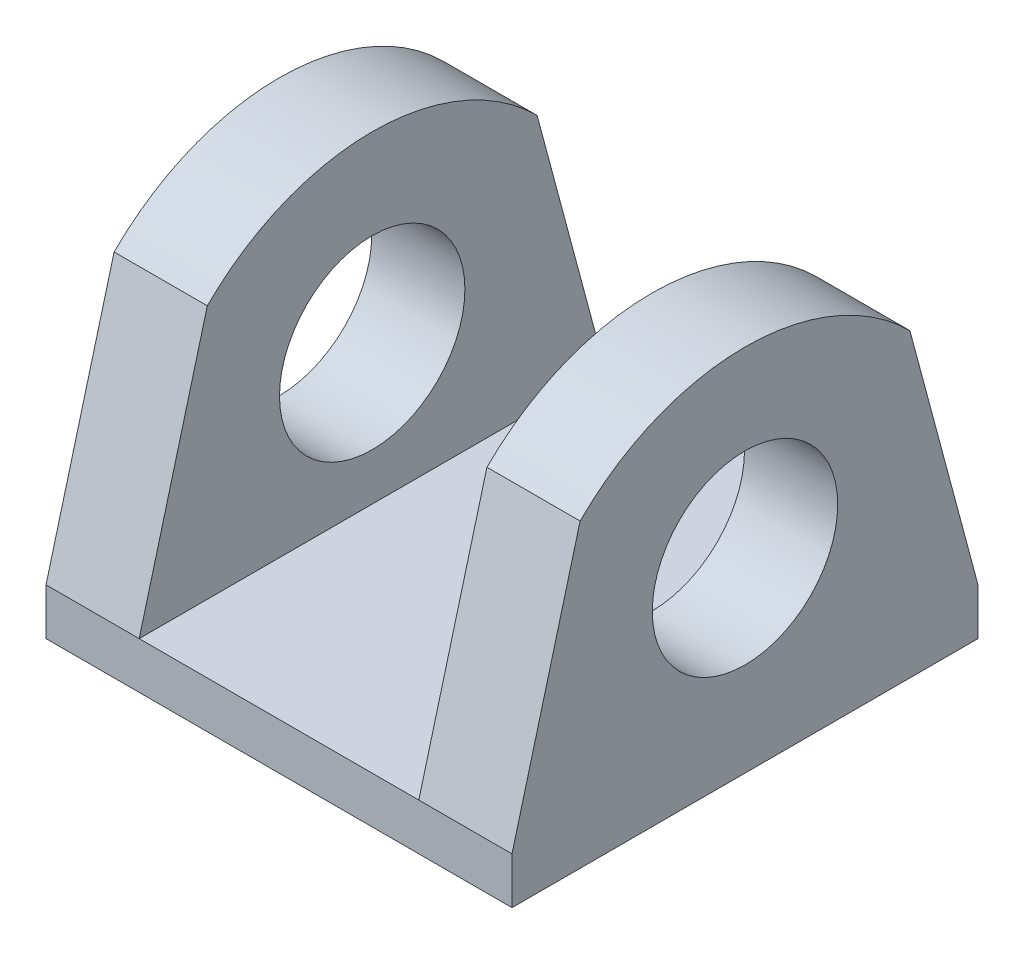
ISO-10303-21;
HEADER;
FILE_DESCRIPTION(('STEP AP214'),'2;1');
FILE_NAME('part.step','',(''),(''),'','','');
FILE_SCHEMA(('AUTOMOTIVE_DESIGN { 1 0 10303 214 1 1 1 1 }'));
ENDSEC;
DATA;
#1=APPLICATION_CONTEXT('core data for automotive mechanical design processes');
#2=APPLICATION_PROTOCOL_DEFINITION('international standard','automotive_design',2000,#1);
#3=PRODUCT_CONTEXT('',#1,'mechanical');
#4=PRODUCT('Part','Part','',(#3));
#5=PRODUCT_RELATED_PRODUCT_CATEGORY('part','',(#4));
#6=PRODUCT_DEFINITION_FORMATION('','',#4);
#7=PRODUCT_DEFINITION_CONTEXT('part definition',#1,'design');
#8=PRODUCT_DEFINITION('design','',#6,#7);
#9=PRODUCT_DEFINITION_SHAPE('','',#8);
#10=(LENGTH_UNIT() NAMED_UNIT(*) SI_UNIT(.MILLI.,.METRE.));
#11=(NAMED_UNIT(*) PLANE_ANGLE_UNIT() SI_UNIT($,.RADIAN.));
#12=(NAMED_UNIT(*) SI_UNIT($,.STERADIAN.) SOLID_ANGLE_UNIT());
#13=UNCERTAINTY_MEASURE_WITH_UNIT(LENGTH_MEASURE(1.E-05),#10,'distance_accuracy_value','');
#14=(GEOMETRIC_REPRESENTATION_CONTEXT(3) GLOBAL_UNCERTAINTY_ASSIGNED_CONTEXT((#13)) GLOBAL_UNIT_ASSIGNED_CONTEXT((#10,
#11,#12)) REPRESENTATION_CONTEXT('',''));
#15=CARTESIAN_POINT('',(0.,0.,0.));
#16=DIRECTION('',(0.,0.,1.));
#17=DIRECTION('',(1.,0.,0.));
#18=AXIS2_PLACEMENT_3D('',#15,#16,#17);
#19=CARTESIAN_POINT('',(12.7,2.54,12.7));
#20=DIRECTION('',(-1.,0.,0.));
#21=DIRECTION('',(0.,0.,1.));
#22=AXIS2_PLACEMENT_3D('',#19,#20,#21);
#23=PLANE('',#22);
#24=CARTESIAN_POINT('',(12.7,10.16,0.));
#25=DIRECTION('',(1.,0.,0.));
#26=DIRECTION('',(0.,0.,-1.));
#27=AXIS2_PLACEMENT_3D('',#24,#25,#26);
#28=CIRCLE('',#27,5.05316944316768);
#29=CARTESIAN_POINT('',(12.7,10.16,-5.05316944316768));
#30=VERTEX_POINT('',#29);
#31=EDGE_CURVE('E245',#30,#30,#28,.T.);
#32=ORIENTED_EDGE('',*,*,#31,.F.);
#33=EDGE_LOOP('',(#32));
#34=FACE_BOUND('',#33,.T.);
#35=DIRECTION('',(0.,0.,-1.));
#36=VECTOR('',#35,1.);
#37=CARTESIAN_POINT('',(12.7,0.,12.7));
#38=LINE('',#37,#36);
#39=CARTESIAN_POINT('',(12.7,0.,12.7));
#40=VERTEX_POINT('',#39);
#41=CARTESIAN_POINT('',(12.7,0.,-12.7));
#42=VERTEX_POINT('',#41);
#43=EDGE_CURVE('E172',#40,#42,#38,.T.);
#44=ORIENTED_EDGE('',*,*,#43,.T.);
#45=DIRECTION('',(0.,-1.,0.));
#46=VECTOR('',#45,1.);
#47=CARTESIAN_POINT('',(12.7,2.54,-12.7));
#48=LINE('',#47,#46);
#49=CARTESIAN_POINT('',(12.7,2.54,-12.7));
#50=VERTEX_POINT('',#49);
#51=EDGE_CURVE('E11',#50,#42,#48,.T.);
#52=ORIENTED_EDGE('',*,*,#51,.F.);
#53=DIRECTION('',(0.,0.965925826289067,0.258819045102525));
#54=VECTOR('',#53,1.);
#55=CARTESIAN_POINT('',(12.7,2.54,-12.7));
#56=LINE('',#55,#54);
#57=CARTESIAN_POINT('',(12.7,16.3947579938712,-8.98762878421351));
#58=VERTEX_POINT('',#57);
#59=EDGE_CURVE('E147',#50,#58,#56,.T.);
#60=ORIENTED_EDGE('',*,*,#59,.T.);
#61=CARTESIAN_POINT('',(12.7,7.40712920965758,0.));
#62=DIRECTION('',(1.,0.,0.));
#63=DIRECTION('',(0.,0.,1.));
#64=AXIS2_PLACEMENT_3D('',#61,#62,#63);
#65=CIRCLE('',#64,12.7104265202097);
#66=CARTESIAN_POINT('',(12.7,16.3947579938712,8.98762878421363));
#67=VERTEX_POINT('',#66);
#68=EDGE_CURVE('E165',#58,#67,#65,.T.);
#69=ORIENTED_EDGE('',*,*,#68,.T.);
#70=DIRECTION('',(0.,-0.965925826289069,0.258819045102518));
#71=VECTOR('',#70,1.);
#72=CARTESIAN_POINT('',(12.7,2.54,12.7));
#73=LINE('',#72,#71);
#74=CARTESIAN_POINT('',(12.7,2.54,12.7));
#75=VERTEX_POINT('',#74);
#76=EDGE_CURVE('E153',#67,#75,#73,.T.);
#77=ORIENTED_EDGE('',*,*,#76,.T.);
#78=DIRECTION('',(0.,-1.,0.));
#79=VECTOR('',#78,1.);
#80=CARTESIAN_POINT('',(12.7,2.54,12.7));
#81=LINE('',#80,#79);
#82=EDGE_CURVE('E182',#75,#40,#81,.T.);
#83=ORIENTED_EDGE('',*,*,#82,.T.);
#84=EDGE_LOOP('',(#44,#52,#60,#69,#77,#83));
#85=FACE_BOUND('',#84,.T.);
#86=ADVANCED_FACE('F33',(#34,#85),#23,.F.);
#87=CARTESIAN_POINT('',(-12.7,2.54,-12.7));
#88=DIRECTION('',(0.,0.,1.));
#89=DIRECTION('',(1.,0.,0.));
#90=AXIS2_PLACEMENT_3D('',#87,#88,#89);
#91=PLANE('',#90);
#92=DIRECTION('',(-1.,0.,0.));
#93=VECTOR('',#92,1.);
#94=CARTESIAN_POINT('',(-12.7,0.,-12.7));
#95=LINE('',#94,#93);
#96=CARTESIAN_POINT('',(-12.7,0.,-12.7));
#97=VERTEX_POINT('',#96);
#98=EDGE_CURVE('E185',#42,#97,#95,.T.);
#99=ORIENTED_EDGE('',*,*,#98,.T.);
#100=DIRECTION('',(0.,-1.,0.));
#101=VECTOR('',#100,1.);
#102=CARTESIAN_POINT('',(-12.7,2.54,-12.7));
#103=LINE('',#102,#101);
#104=CARTESIAN_POINT('',(-12.7,2.54,-12.7));
#105=VERTEX_POINT('',#104);
#106=EDGE_CURVE('E41',#105,#97,#103,.T.);
#107=ORIENTED_EDGE('',*,*,#106,.F.);
#108=DIRECTION('',(-1.,0.,0.));
#109=VECTOR('',#108,1.);
#110=CARTESIAN_POINT('',(-7.62,2.54,-12.7));
#111=LINE('',#110,#109);
#112=CARTESIAN_POINT('',(-7.62,2.54,-12.7));
#113=VERTEX_POINT('',#112);
#114=EDGE_CURVE('E48',#113,#105,#111,.T.);
#115=ORIENTED_EDGE('',*,*,#114,.F.);
#116=DIRECTION('',(-1.,0.,0.));
#117=VECTOR('',#116,1.);
#118=CARTESIAN_POINT('',(-12.7,2.54,-12.7));
#119=LINE('',#118,#117);
#120=CARTESIAN_POINT('',(7.62,2.54,-12.7));
#121=VERTEX_POINT('',#120);
#122=EDGE_CURVE('E180',#121,#113,#119,.T.);
#123=ORIENTED_EDGE('',*,*,#122,.F.);
#124=EDGE_CURVE('E176',#50,#121,#119,.T.);
#125=ORIENTED_EDGE('',*,*,#124,.F.);
#126=ORIENTED_EDGE('',*,*,#51,.T.);
#127=EDGE_LOOP('',(#99,#107,#115,#123,#125,#126));
#128=FACE_BOUND('',#127,.T.);
#129=ADVANCED_FACE('F225',(#128),#91,.F.);
#130=CARTESIAN_POINT('',(-12.7,2.54,12.7));
#131=DIRECTION('',(1.,0.,0.));
#132=DIRECTION('',(0.,0.,-1.));
#133=AXIS2_PLACEMENT_3D('',#130,#131,#132);
#134=PLANE('',#133);
#135=CARTESIAN_POINT('',(-12.7,10.16,0.));
#136=DIRECTION('',(1.,0.,0.));
#137=DIRECTION('',(0.,0.,-1.));
#138=AXIS2_PLACEMENT_3D('',#135,#136,#137);
#139=CIRCLE('',#138,5.05316944316768);
#140=CARTESIAN_POINT('',(-12.7,10.16,-5.05316944316768));
#141=VERTEX_POINT('',#140);
#142=EDGE_CURVE('E247',#141,#141,#139,.T.);
#143=ORIENTED_EDGE('',*,*,#142,.T.);
#144=EDGE_LOOP('',(#143));
#145=FACE_BOUND('',#144,.T.);
#146=DIRECTION('',(0.,0.,1.));
#147=VECTOR('',#146,1.);
#148=CARTESIAN_POINT('',(-12.7,0.,12.7));
#149=LINE('',#148,#147);
#150=CARTESIAN_POINT('',(-12.7,0.,12.7));
#151=VERTEX_POINT('',#150);
#152=EDGE_CURVE('E187',#97,#151,#149,.T.);
#153=ORIENTED_EDGE('',*,*,#152,.T.);
#154=DIRECTION('',(0.,-1.,0.));
#155=VECTOR('',#154,1.);
#156=CARTESIAN_POINT('',(-12.7,2.54,12.7));
#157=LINE('',#156,#155);
#158=CARTESIAN_POINT('',(-12.7,2.54,12.7));
#159=VERTEX_POINT('',#158);
#160=EDGE_CURVE('E193',#159,#151,#157,.T.);
#161=ORIENTED_EDGE('',*,*,#160,.F.);
#162=DIRECTION('',(0.,-0.965925826289069,0.258819045102518));
#163=VECTOR('',#162,1.);
#164=CARTESIAN_POINT('',(-12.7,2.54,12.7));
#165=LINE('',#164,#163);
#166=CARTESIAN_POINT('',(-12.7,16.3947579938712,8.98762878421363));
#167=VERTEX_POINT('',#166);
#168=EDGE_CURVE('E141',#167,#159,#165,.T.);
#169=ORIENTED_EDGE('',*,*,#168,.F.);
#170=CARTESIAN_POINT('',(-12.7,7.40712920965758,0.));
#171=DIRECTION('',(1.,0.,0.));
#172=DIRECTION('',(0.,0.,1.));
#173=AXIS2_PLACEMENT_3D('',#170,#171,#172);
#174=CIRCLE('',#173,12.7104265202097);
#175=CARTESIAN_POINT('',(-12.7,16.3947579938712,-8.98762878421351));
#176=VERTEX_POINT('',#175);
#177=EDGE_CURVE('E127',#176,#167,#174,.T.);
#178=ORIENTED_EDGE('',*,*,#177,.F.);
#179=DIRECTION('',(0.,0.965925826289067,0.258819045102525));
#180=VECTOR('',#179,1.);
#181=CARTESIAN_POINT('',(-12.7,2.54,-12.7));
#182=LINE('',#181,#180);
#183=EDGE_CURVE('E136',#105,#176,#182,.T.);
#184=ORIENTED_EDGE('',*,*,#183,.F.);
#185=ORIENTED_EDGE('',*,*,#106,.T.);
#186=EDGE_LOOP('',(#153,#161,#169,#178,#184,#185));
#187=FACE_BOUND('',#186,.T.);
#188=ADVANCED_FACE('F200',(#145,#187),#134,.F.);
#189=CARTESIAN_POINT('',(-12.7,2.54,12.7));
#190=DIRECTION('',(0.,0.,-1.));
#191=DIRECTION('',(-1.,0.,0.));
#192=AXIS2_PLACEMENT_3D('',#189,#190,#191);
#193=PLANE('',#192);
#194=DIRECTION('',(1.,0.,0.));
#195=VECTOR('',#194,1.);
#196=CARTESIAN_POINT('',(-12.7,0.,12.7));
#197=LINE('',#196,#195);
#198=EDGE_CURVE('E189',#151,#40,#197,.T.);
#199=ORIENTED_EDGE('',*,*,#198,.T.);
#200=ORIENTED_EDGE('',*,*,#82,.F.);
#201=DIRECTION('',(1.,0.,0.));
#202=VECTOR('',#201,1.);
#203=CARTESIAN_POINT('',(7.62,2.54,12.7));
#204=LINE('',#203,#202);
#205=CARTESIAN_POINT('',(7.62,2.54,12.7));
#206=VERTEX_POINT('',#205);
#207=EDGE_CURVE('E170',#206,#75,#204,.T.);
#208=ORIENTED_EDGE('',*,*,#207,.F.);
#209=DIRECTION('',(1.,0.,0.));
#210=VECTOR('',#209,1.);
#211=CARTESIAN_POINT('',(-12.7,2.54,12.7));
#212=LINE('',#211,#210);
#213=CARTESIAN_POINT('',(-7.62,2.54,12.7));
#214=VERTEX_POINT('',#213);
#215=EDGE_CURVE('E179',#214,#206,#212,.T.);
#216=ORIENTED_EDGE('',*,*,#215,.F.);
#217=EDGE_CURVE('E134',#159,#214,#212,.T.);
#218=ORIENTED_EDGE('',*,*,#217,.F.);
#219=ORIENTED_EDGE('',*,*,#160,.T.);
#220=EDGE_LOOP('',(#199,#200,#208,#216,#218,#219));
#221=FACE_BOUND('',#220,.T.);
#222=ADVANCED_FACE('F208',(#221),#193,.F.);
#223=CARTESIAN_POINT('',(0.,2.54,0.));
#224=DIRECTION('',(0.,-1.,0.));
#225=DIRECTION('',(0.,0.,-1.));
#226=AXIS2_PLACEMENT_3D('',#223,#224,#225);
#227=PLANE('',#226);
#228=ORIENTED_EDGE('',*,*,#122,.T.);
#229=DIRECTION('',(0.,0.,-1.));
#230=VECTOR('',#229,1.);
#231=CARTESIAN_POINT('',(-7.62,2.54,12.7));
#232=LINE('',#231,#230);
#233=EDGE_CURVE('E55',#214,#113,#232,.T.);
#234=ORIENTED_EDGE('',*,*,#233,.F.);
#235=ORIENTED_EDGE('',*,*,#215,.T.);
#236=DIRECTION('',(0.,0.,-1.));
#237=VECTOR('',#236,1.);
#238=CARTESIAN_POINT('',(7.62,2.54,12.7));
#239=LINE('',#238,#237);
#240=EDGE_CURVE('E149',#206,#121,#239,.T.);
#241=ORIENTED_EDGE('',*,*,#240,.T.);
#242=EDGE_LOOP('',(#228,#234,#235,#241));
#243=FACE_BOUND('',#242,.T.);
#244=ADVANCED_FACE('F218',(#243),#227,.F.);
#245=CARTESIAN_POINT('',(0.,0.,0.));
#246=DIRECTION('',(0.,-1.,0.));
#247=DIRECTION('',(0.,0.,-1.));
#248=AXIS2_PLACEMENT_3D('',#245,#246,#247);
#249=PLANE('',#248);
#250=ORIENTED_EDGE('',*,*,#43,.F.);
#251=ORIENTED_EDGE('',*,*,#198,.F.);
#252=ORIENTED_EDGE('',*,*,#152,.F.);
#253=ORIENTED_EDGE('',*,*,#98,.F.);
#254=EDGE_LOOP('',(#250,#251,#252,#253));
#255=FACE_BOUND('',#254,.T.);
#256=ADVANCED_FACE('F205',(#255),#249,.T.);
#257=CARTESIAN_POINT('',(7.62,2.54,12.7));
#258=DIRECTION('',(0.,0.258819045102518,0.965925826289069));
#259=DIRECTION('',(0.,-0.965925826289069,0.258819045102518));
#260=AXIS2_PLACEMENT_3D('',#257,#258,#259);
#261=PLANE('',#260);
#262=ORIENTED_EDGE('',*,*,#76,.F.);
#263=DIRECTION('',(1.,0.,0.));
#264=VECTOR('',#263,1.);
#265=CARTESIAN_POINT('',(7.62,16.3947579938712,8.98762878421363));
#266=LINE('',#265,#264);
#267=CARTESIAN_POINT('',(7.62,16.3947579938712,8.98762878421363));
#268=VERTEX_POINT('',#267);
#269=EDGE_CURVE('E173',#268,#67,#266,.T.);
#270=ORIENTED_EDGE('',*,*,#269,.F.);
#271=DIRECTION('',(0.,-0.965925826289069,0.258819045102518));
#272=VECTOR('',#271,1.);
#273=CARTESIAN_POINT('',(7.62,2.54,12.7));
#274=LINE('',#273,#272);
#275=EDGE_CURVE('E159',#268,#206,#274,.T.);
#276=ORIENTED_EDGE('',*,*,#275,.T.);
#277=ORIENTED_EDGE('',*,*,#207,.T.);
#278=EDGE_LOOP('',(#262,#270,#276,#277));
#279=FACE_BOUND('',#278,.T.);
#280=ADVANCED_FACE('F215',(#279),#261,.T.);
#281=CARTESIAN_POINT('',(7.62,7.40712920965758,0.));
#282=DIRECTION('',(1.,0.,0.));
#283=DIRECTION('',(0.,0.,-1.));
#284=AXIS2_PLACEMENT_3D('',#281,#282,#283);
#285=CYLINDRICAL_SURFACE('',#284,12.7104265202097);
#286=ORIENTED_EDGE('',*,*,#68,.F.);
#287=DIRECTION('',(1.,0.,0.));
#288=VECTOR('',#287,1.);
#289=CARTESIAN_POINT('',(7.62,16.3947579938712,-8.98762878421351));
#290=LINE('',#289,#288);
#291=CARTESIAN_POINT('',(7.62,16.3947579938712,-8.98762878421351));
#292=VERTEX_POINT('',#291);
#293=EDGE_CURVE('E162',#292,#58,#290,.T.);
#294=ORIENTED_EDGE('',*,*,#293,.F.);
#295=CARTESIAN_POINT('',(7.62,7.40712920965758,0.));
#296=DIRECTION('',(1.,0.,0.));
#297=DIRECTION('',(0.,0.,1.));
#298=AXIS2_PLACEMENT_3D('',#295,#296,#297);
#299=CIRCLE('',#298,12.7104265202097);
#300=EDGE_CURVE('E156',#292,#268,#299,.T.);
#301=ORIENTED_EDGE('',*,*,#300,.T.);
#302=ORIENTED_EDGE('',*,*,#269,.T.);
#303=EDGE_LOOP('',(#286,#294,#301,#302));
#304=FACE_BOUND('',#303,.T.);
#305=ADVANCED_FACE('F273',(#304),#285,.T.);
#306=CARTESIAN_POINT('',(7.62,2.54,-12.7));
#307=DIRECTION('',(0.,0.258819045102525,-0.965925826289067));
#308=DIRECTION('',(0.,0.965925826289067,0.258819045102525));
#309=AXIS2_PLACEMENT_3D('',#306,#307,#308);
#310=PLANE('',#309);
#311=ORIENTED_EDGE('',*,*,#59,.F.);
#312=ORIENTED_EDGE('',*,*,#124,.T.);
#313=DIRECTION('',(0.,0.965925826289067,0.258819045102525));
#314=VECTOR('',#313,1.);
#315=CARTESIAN_POINT('',(7.62,2.54,-12.7));
#316=LINE('',#315,#314);
#317=EDGE_CURVE('E152',#121,#292,#316,.T.);
#318=ORIENTED_EDGE('',*,*,#317,.T.);
#319=ORIENTED_EDGE('',*,*,#293,.T.);
#320=EDGE_LOOP('',(#311,#312,#318,#319));
#321=FACE_BOUND('',#320,.T.);
#322=ADVANCED_FACE('F224',(#321),#310,.T.);
#323=CARTESIAN_POINT('',(7.62,7.40712920965758,0.));
#324=DIRECTION('',(-1.,0.,0.));
#325=DIRECTION('',(0.,0.,1.));
#326=AXIS2_PLACEMENT_3D('',#323,#324,#325);
#327=PLANE('',#326);
#328=CARTESIAN_POINT('',(7.62,10.16,0.));
#329=DIRECTION('',(-1.,0.,0.));
#330=DIRECTION('',(0.,0.,1.));
#331=AXIS2_PLACEMENT_3D('',#328,#329,#330);
#332=CIRCLE('',#331,5.05316944316768);
#333=CARTESIAN_POINT('',(7.62,10.16,5.05316944316768));
#334=VERTEX_POINT('',#333);
#335=EDGE_CURVE('E143',#334,#334,#332,.T.);
#336=ORIENTED_EDGE('',*,*,#335,.F.);
#337=EDGE_LOOP('',(#336));
#338=FACE_BOUND('',#337,.T.);
#339=ORIENTED_EDGE('',*,*,#240,.F.);
#340=ORIENTED_EDGE('',*,*,#275,.F.);
#341=ORIENTED_EDGE('',*,*,#300,.F.);
#342=ORIENTED_EDGE('',*,*,#317,.F.);
#343=EDGE_LOOP('',(#339,#340,#341,#342));
#344=FACE_BOUND('',#343,.T.);
#345=ADVANCED_FACE('F220',(#338,#344),#327,.T.);
#346=CARTESIAN_POINT('',(-7.62,2.54,-12.7));
#347=DIRECTION('',(0.,-0.258819045102525,0.965925826289067));
#348=DIRECTION('',(0.,-0.965925826289067,-0.258819045102525));
#349=AXIS2_PLACEMENT_3D('',#346,#347,#348);
#350=PLANE('',#349);
#351=ORIENTED_EDGE('',*,*,#183,.T.);
#352=DIRECTION('',(-1.,0.,0.));
#353=VECTOR('',#352,1.);
#354=CARTESIAN_POINT('',(-7.62,16.3947579938712,-8.98762878421351));
#355=LINE('',#354,#353);
#356=CARTESIAN_POINT('',(-7.62,16.3947579938712,-8.98762878421351));
#357=VERTEX_POINT('',#356);
#358=EDGE_CURVE('E131',#357,#176,#355,.T.);
#359=ORIENTED_EDGE('',*,*,#358,.F.);
#360=DIRECTION('',(0.,0.965925826289067,0.258819045102525));
#361=VECTOR('',#360,1.);
#362=CARTESIAN_POINT('',(-7.62,2.54,-12.7));
#363=LINE('',#362,#361);
#364=EDGE_CURVE('E118',#113,#357,#363,.T.);
#365=ORIENTED_EDGE('',*,*,#364,.F.);
#366=ORIENTED_EDGE('',*,*,#114,.T.);
#367=EDGE_LOOP('',(#351,#359,#365,#366));
#368=FACE_BOUND('',#367,.T.);
#369=ADVANCED_FACE('F227',(#368),#350,.F.);
#370=CARTESIAN_POINT('',(-7.62,7.40712920965758,0.));
#371=DIRECTION('',(-1.,0.,0.));
#372=DIRECTION('',(0.,0.,1.));
#373=AXIS2_PLACEMENT_3D('',#370,#371,#372);
#374=CYLINDRICAL_SURFACE('',#373,12.7104265202097);
#375=ORIENTED_EDGE('',*,*,#177,.T.);
#376=DIRECTION('',(-1.,0.,0.));
#377=VECTOR('',#376,1.);
#378=CARTESIAN_POINT('',(-7.62,16.3947579938712,8.98762878421363));
#379=LINE('',#378,#377);
#380=CARTESIAN_POINT('',(-7.62,16.3947579938712,8.98762878421363));
#381=VERTEX_POINT('',#380);
#382=EDGE_CURVE('E124',#381,#167,#379,.T.);
#383=ORIENTED_EDGE('',*,*,#382,.F.);
#384=CARTESIAN_POINT('',(-7.62,7.40712920965758,0.));
#385=DIRECTION('',(1.,0.,0.));
#386=DIRECTION('',(0.,0.,1.));
#387=AXIS2_PLACEMENT_3D('',#384,#385,#386);
#388=CIRCLE('',#387,12.7104265202097);
#389=EDGE_CURVE('E111',#357,#381,#388,.T.);
#390=ORIENTED_EDGE('',*,*,#389,.F.);
#391=ORIENTED_EDGE('',*,*,#358,.T.);
#392=EDGE_LOOP('',(#375,#383,#390,#391));
#393=FACE_BOUND('',#392,.T.);
#394=ADVANCED_FACE('F125',(#393),#374,.T.);
#395=CARTESIAN_POINT('',(-7.62,2.54,12.7));
#396=DIRECTION('',(0.,-0.258819045102518,-0.965925826289069));
#397=DIRECTION('',(0.,0.965925826289069,-0.258819045102518));
#398=AXIS2_PLACEMENT_3D('',#395,#396,#397);
#399=PLANE('',#398);
#400=ORIENTED_EDGE('',*,*,#168,.T.);
#401=ORIENTED_EDGE('',*,*,#217,.T.);
#402=DIRECTION('',(0.,-0.965925826289069,0.258819045102518));
#403=VECTOR('',#402,1.);
#404=CARTESIAN_POINT('',(-7.62,2.54,12.7));
#405=LINE('',#404,#403);
#406=EDGE_CURVE('E115',#381,#214,#405,.T.);
#407=ORIENTED_EDGE('',*,*,#406,.F.);
#408=ORIENTED_EDGE('',*,*,#382,.T.);
#409=EDGE_LOOP('',(#400,#401,#407,#408));
#410=FACE_BOUND('',#409,.T.);
#411=ADVANCED_FACE('F133',(#410),#399,.F.);
#412=CARTESIAN_POINT('',(-7.62,7.40712920965758,0.));
#413=DIRECTION('',(1.,0.,0.));
#414=DIRECTION('',(0.,0.,1.));
#415=AXIS2_PLACEMENT_3D('',#412,#413,#414);
#416=PLANE('',#415);
#417=CARTESIAN_POINT('',(-7.62,10.16,0.));
#418=DIRECTION('',(1.,0.,0.));
#419=DIRECTION('',(0.,0.,-1.));
#420=AXIS2_PLACEMENT_3D('',#417,#418,#419);
#421=CIRCLE('',#420,5.05316944316768);
#422=CARTESIAN_POINT('',(-7.62,10.16,-5.05316944316768));
#423=VERTEX_POINT('',#422);
#424=EDGE_CURVE('E36',#423,#423,#421,.T.);
#425=ORIENTED_EDGE('',*,*,#424,.F.);
#426=EDGE_LOOP('',(#425));
#427=FACE_BOUND('',#426,.T.);
#428=ORIENTED_EDGE('',*,*,#233,.T.);
#429=ORIENTED_EDGE('',*,*,#364,.T.);
#430=ORIENTED_EDGE('',*,*,#389,.T.);
#431=ORIENTED_EDGE('',*,*,#406,.T.);
#432=EDGE_LOOP('',(#428,#429,#430,#431));
#433=FACE_BOUND('',#432,.T.);
#434=ADVANCED_FACE('F113',(#427,#433),#416,.T.);
#435=CARTESIAN_POINT('',(-12.7,10.16,0.));
#436=DIRECTION('',(1.,0.,0.));
#437=DIRECTION('',(0.,0.,-1.));
#438=AXIS2_PLACEMENT_3D('',#435,#436,#437);
#439=CYLINDRICAL_SURFACE('',#438,5.05316944316768);
#440=ORIENTED_EDGE('',*,*,#424,.T.);
#441=EDGE_LOOP('',(#440));
#442=FACE_BOUND('',#441,.T.);
#443=ORIENTED_EDGE('',*,*,#142,.F.);
#444=EDGE_LOOP('',(#443));
#445=FACE_BOUND('',#444,.T.);
#446=ADVANCED_FACE('F257',(#442,#445),#439,.F.);
#447=ORIENTED_EDGE('',*,*,#335,.T.);
#448=EDGE_LOOP('',(#447));
#449=FACE_BOUND('',#448,.T.);
#450=ORIENTED_EDGE('',*,*,#31,.T.);
#451=EDGE_LOOP('',(#450));
#452=FACE_BOUND('',#451,.T.);
#453=ADVANCED_FACE('F265',(#449,#452),#439,.F.);
#454=CLOSED_SHELL('',(#86,#129,#188,#222,#244,#256,#280,#305,#322,#345,#369,#394,#411,#434,#446,#453));
#455=MANIFOLD_SOLID_BREP('B2',#454);
#456=ADVANCED_BREP_SHAPE_REPRESENTATION('',(#18,#455),#14);
#457=SHAPE_DEFINITION_REPRESENTATION(#9,#456);
ENDSEC;
END-ISO-10303-21;
